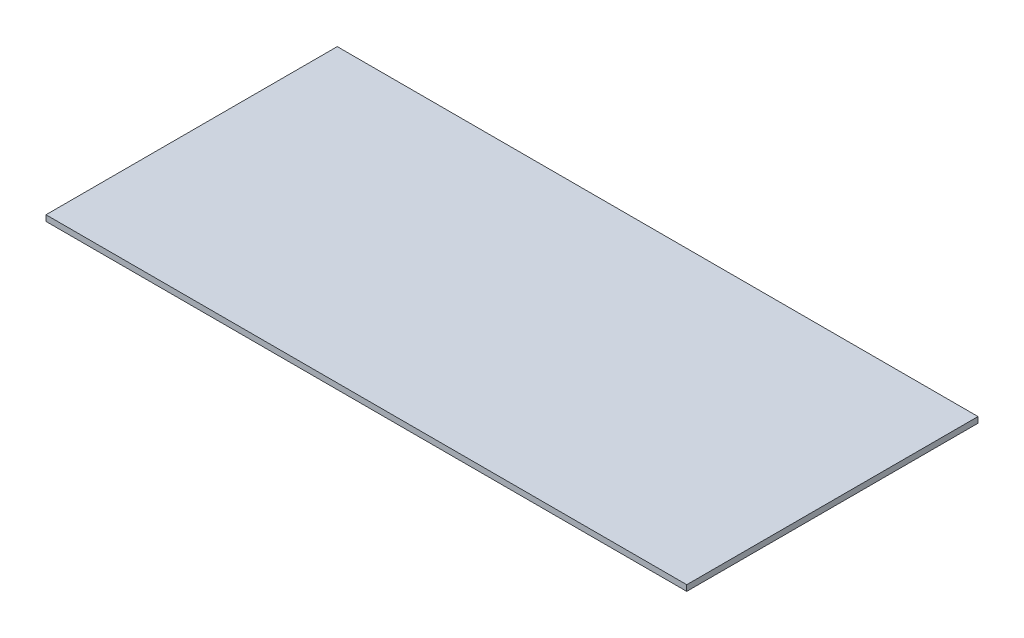
ISO-10303-21;
HEADER;
FILE_DESCRIPTION(('STEP AP214'),'2;1');
FILE_NAME('part.step','',(''),(''),'','','');
FILE_SCHEMA(('AUTOMOTIVE_DESIGN { 1 0 10303 214 1 1 1 1 }'));
ENDSEC;
DATA;
#1=APPLICATION_CONTEXT('core data for automotive mechanical design processes');
#2=APPLICATION_PROTOCOL_DEFINITION('international standard','automotive_design',2000,#1);
#3=PRODUCT_CONTEXT('',#1,'mechanical');
#4=PRODUCT('Part','Part','',(#3));
#5=PRODUCT_RELATED_PRODUCT_CATEGORY('part','',(#4));
#6=PRODUCT_DEFINITION_FORMATION('','',#4);
#7=PRODUCT_DEFINITION_CONTEXT('part definition',#1,'design');
#8=PRODUCT_DEFINITION('design','',#6,#7);
#9=PRODUCT_DEFINITION_SHAPE('','',#8);
#10=(LENGTH_UNIT() NAMED_UNIT(*) SI_UNIT(.MILLI.,.METRE.));
#11=(NAMED_UNIT(*) PLANE_ANGLE_UNIT() SI_UNIT($,.RADIAN.));
#12=(NAMED_UNIT(*) SI_UNIT($,.STERADIAN.) SOLID_ANGLE_UNIT());
#13=UNCERTAINTY_MEASURE_WITH_UNIT(LENGTH_MEASURE(1.E-05),#10,'distance_accuracy_value','');
#14=(GEOMETRIC_REPRESENTATION_CONTEXT(3) GLOBAL_UNCERTAINTY_ASSIGNED_CONTEXT((#13)) GLOBAL_UNIT_ASSIGNED_CONTEXT((#10,
#11,#12)) REPRESENTATION_CONTEXT('',''));
#15=CARTESIAN_POINT('',(0.,0.,0.));
#16=DIRECTION('',(0.,0.,1.));
#17=DIRECTION('',(1.,0.,0.));
#18=AXIS2_PLACEMENT_3D('',#15,#16,#17);
#19=CARTESIAN_POINT('',(0.,3.,0.));
#20=DIRECTION('',(1.,0.,0.));
#21=DIRECTION('',(0.,0.,-1.));
#22=AXIS2_PLACEMENT_3D('',#19,#20,#21);
#23=PLANE('',#22);
#24=DIRECTION('',(0.,0.,1.));
#25=VECTOR('',#24,1.);
#26=CARTESIAN_POINT('',(0.,0.,0.));
#27=LINE('',#26,#25);
#28=CARTESIAN_POINT('',(0.,0.,-150.));
#29=VERTEX_POINT('',#28);
#30=CARTESIAN_POINT('',(0.,0.,0.));
#31=VERTEX_POINT('',#30);
#32=EDGE_CURVE('E110',#29,#31,#27,.T.);
#33=ORIENTED_EDGE('',*,*,#32,.T.);
#34=DIRECTION('',(0.,-1.,0.));
#35=VECTOR('',#34,1.);
#36=CARTESIAN_POINT('',(0.,3.,0.));
#37=LINE('',#36,#35);
#38=CARTESIAN_POINT('',(0.,3.,0.));
#39=VERTEX_POINT('',#38);
#40=EDGE_CURVE('E11',#39,#31,#37,.T.);
#41=ORIENTED_EDGE('',*,*,#40,.F.);
#42=DIRECTION('',(0.,0.,1.));
#43=VECTOR('',#42,1.);
#44=CARTESIAN_POINT('',(0.,3.,0.));
#45=LINE('',#44,#43);
#46=CARTESIAN_POINT('',(0.,3.,-150.));
#47=VERTEX_POINT('',#46);
#48=EDGE_CURVE('E94',#47,#39,#45,.T.);
#49=ORIENTED_EDGE('',*,*,#48,.F.);
#50=DIRECTION('',(0.,-1.,0.));
#51=VECTOR('',#50,1.);
#52=CARTESIAN_POINT('',(0.,3.,-150.));
#53=LINE('',#52,#51);
#54=EDGE_CURVE('E106',#47,#29,#53,.T.);
#55=ORIENTED_EDGE('',*,*,#54,.T.);
#56=EDGE_LOOP('',(#33,#41,#49,#55));
#57=FACE_BOUND('',#56,.T.);
#58=ADVANCED_FACE('F42',(#57),#23,.F.);
#59=CARTESIAN_POINT('',(0.,3.,0.));
#60=DIRECTION('',(0.,0.,-1.));
#61=DIRECTION('',(-1.,0.,0.));
#62=AXIS2_PLACEMENT_3D('',#59,#60,#61);
#63=PLANE('',#62);
#64=DIRECTION('',(1.,0.,0.));
#65=VECTOR('',#64,1.);
#66=CARTESIAN_POINT('',(0.,0.,0.));
#67=LINE('',#66,#65);
#68=CARTESIAN_POINT('',(330.,0.,0.));
#69=VERTEX_POINT('',#68);
#70=EDGE_CURVE('E99',#31,#69,#67,.T.);
#71=ORIENTED_EDGE('',*,*,#70,.T.);
#72=DIRECTION('',(0.,-1.,0.));
#73=VECTOR('',#72,1.);
#74=CARTESIAN_POINT('',(330.,3.,0.));
#75=LINE('',#74,#73);
#76=CARTESIAN_POINT('',(330.,3.,0.));
#77=VERTEX_POINT('',#76);
#78=EDGE_CURVE('E51',#77,#69,#75,.T.);
#79=ORIENTED_EDGE('',*,*,#78,.F.);
#80=DIRECTION('',(1.,0.,0.));
#81=VECTOR('',#80,1.);
#82=CARTESIAN_POINT('',(0.,3.,0.));
#83=LINE('',#82,#81);
#84=EDGE_CURVE('E89',#39,#77,#83,.T.);
#85=ORIENTED_EDGE('',*,*,#84,.F.);
#86=ORIENTED_EDGE('',*,*,#40,.T.);
#87=EDGE_LOOP('',(#71,#79,#85,#86));
#88=FACE_BOUND('',#87,.T.);
#89=ADVANCED_FACE('F98',(#88),#63,.F.);
#90=CARTESIAN_POINT('',(330.,3.,0.));
#91=DIRECTION('',(-1.,0.,0.));
#92=DIRECTION('',(0.,0.,1.));
#93=AXIS2_PLACEMENT_3D('',#90,#91,#92);
#94=PLANE('',#93);
#95=DIRECTION('',(0.,0.,-1.));
#96=VECTOR('',#95,1.);
#97=CARTESIAN_POINT('',(330.,0.,0.));
#98=LINE('',#97,#96);
#99=CARTESIAN_POINT('',(330.,0.,-150.));
#100=VERTEX_POINT('',#99);
#101=EDGE_CURVE('E76',#69,#100,#98,.T.);
#102=ORIENTED_EDGE('',*,*,#101,.T.);
#103=DIRECTION('',(0.,-1.,0.));
#104=VECTOR('',#103,1.);
#105=CARTESIAN_POINT('',(330.,3.,-150.));
#106=LINE('',#105,#104);
#107=CARTESIAN_POINT('',(330.,3.,-150.));
#108=VERTEX_POINT('',#107);
#109=EDGE_CURVE('E101',#108,#100,#106,.T.);
#110=ORIENTED_EDGE('',*,*,#109,.F.);
#111=DIRECTION('',(0.,0.,-1.));
#112=VECTOR('',#111,1.);
#113=CARTESIAN_POINT('',(330.,3.,0.));
#114=LINE('',#113,#112);
#115=EDGE_CURVE('E92',#77,#108,#114,.T.);
#116=ORIENTED_EDGE('',*,*,#115,.F.);
#117=ORIENTED_EDGE('',*,*,#78,.T.);
#118=EDGE_LOOP('',(#102,#110,#116,#117));
#119=FACE_BOUND('',#118,.T.);
#120=ADVANCED_FACE('F102',(#119),#94,.F.);
#121=CARTESIAN_POINT('',(0.,3.,-150.));
#122=DIRECTION('',(0.,0.,1.));
#123=DIRECTION('',(1.,0.,0.));
#124=AXIS2_PLACEMENT_3D('',#121,#122,#123);
#125=PLANE('',#124);
#126=DIRECTION('',(-1.,0.,0.));
#127=VECTOR('',#126,1.);
#128=CARTESIAN_POINT('',(0.,0.,-150.));
#129=LINE('',#128,#127);
#130=EDGE_CURVE('E82',#100,#29,#129,.T.);
#131=ORIENTED_EDGE('',*,*,#130,.T.);
#132=ORIENTED_EDGE('',*,*,#54,.F.);
#133=DIRECTION('',(-1.,0.,0.));
#134=VECTOR('',#133,1.);
#135=CARTESIAN_POINT('',(0.,3.,-150.));
#136=LINE('',#135,#134);
#137=EDGE_CURVE('E59',#108,#47,#136,.T.);
#138=ORIENTED_EDGE('',*,*,#137,.F.);
#139=ORIENTED_EDGE('',*,*,#109,.T.);
#140=EDGE_LOOP('',(#131,#132,#138,#139));
#141=FACE_BOUND('',#140,.T.);
#142=ADVANCED_FACE('F123',(#141),#125,.F.);
#143=CARTESIAN_POINT('',(0.,3.,0.));
#144=DIRECTION('',(0.,-1.,0.));
#145=DIRECTION('',(0.,0.,-1.));
#146=AXIS2_PLACEMENT_3D('',#143,#144,#145);
#147=PLANE('',#146);
#148=ORIENTED_EDGE('',*,*,#48,.T.);
#149=ORIENTED_EDGE('',*,*,#84,.T.);
#150=ORIENTED_EDGE('',*,*,#115,.T.);
#151=ORIENTED_EDGE('',*,*,#137,.T.);
#152=EDGE_LOOP('',(#148,#149,#150,#151));
#153=FACE_BOUND('',#152,.T.);
#154=ADVANCED_FACE('F90',(#153),#147,.F.);
#155=CARTESIAN_POINT('',(0.,0.,0.));
#156=DIRECTION('',(0.,-1.,0.));
#157=DIRECTION('',(0.,0.,-1.));
#158=AXIS2_PLACEMENT_3D('',#155,#156,#157);
#159=PLANE('',#158);
#160=ORIENTED_EDGE('',*,*,#32,.F.);
#161=ORIENTED_EDGE('',*,*,#130,.F.);
#162=ORIENTED_EDGE('',*,*,#101,.F.);
#163=ORIENTED_EDGE('',*,*,#70,.F.);
#164=EDGE_LOOP('',(#160,#161,#162,#163));
#165=FACE_BOUND('',#164,.T.);
#166=ADVANCED_FACE('F126',(#165),#159,.T.);
#167=CLOSED_SHELL('',(#58,#89,#120,#142,#154,#166));
#168=MANIFOLD_SOLID_BREP('B2',#167);
#169=ADVANCED_BREP_SHAPE_REPRESENTATION('',(#18,#168),#14);
#170=SHAPE_DEFINITION_REPRESENTATION(#9,#169);
ENDSEC;
END-ISO-10303-21;
